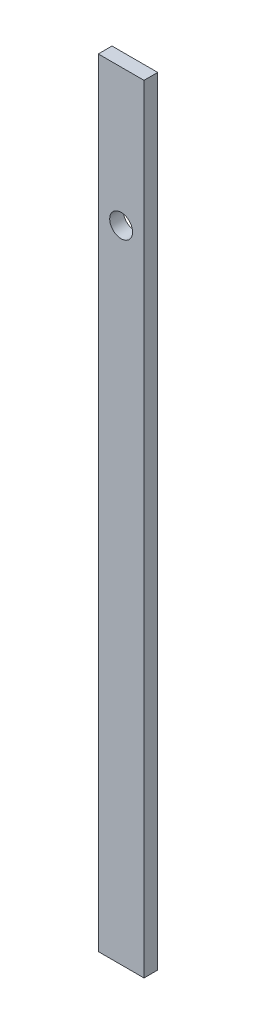
ISO-10303-21;
HEADER;
FILE_DESCRIPTION(('STEP AP214'),'2;1');
FILE_NAME('part.step','',(''),(''),'','','');
FILE_SCHEMA(('AUTOMOTIVE_DESIGN { 1 0 10303 214 1 1 1 1 }'));
ENDSEC;
DATA;
#1=APPLICATION_CONTEXT('core data for automotive mechanical design processes');
#2=APPLICATION_PROTOCOL_DEFINITION('international standard','automotive_design',2000,#1);
#3=PRODUCT_CONTEXT('',#1,'mechanical');
#4=PRODUCT('Part','Part','',(#3));
#5=PRODUCT_RELATED_PRODUCT_CATEGORY('part','',(#4));
#6=PRODUCT_DEFINITION_FORMATION('','',#4);
#7=PRODUCT_DEFINITION_CONTEXT('part definition',#1,'design');
#8=PRODUCT_DEFINITION('design','',#6,#7);
#9=PRODUCT_DEFINITION_SHAPE('','',#8);
#10=(LENGTH_UNIT() NAMED_UNIT(*) SI_UNIT(.MILLI.,.METRE.));
#11=(NAMED_UNIT(*) PLANE_ANGLE_UNIT() SI_UNIT($,.RADIAN.));
#12=(NAMED_UNIT(*) SI_UNIT($,.STERADIAN.) SOLID_ANGLE_UNIT());
#13=UNCERTAINTY_MEASURE_WITH_UNIT(LENGTH_MEASURE(1.E-05),#10,'distance_accuracy_value','');
#14=(GEOMETRIC_REPRESENTATION_CONTEXT(3) GLOBAL_UNCERTAINTY_ASSIGNED_CONTEXT((#13)) GLOBAL_UNIT_ASSIGNED_CONTEXT((#10,
#11,#12)) REPRESENTATION_CONTEXT('',''));
#15=CARTESIAN_POINT('',(0.,0.,0.));
#16=DIRECTION('',(0.,0.,1.));
#17=DIRECTION('',(1.,0.,0.));
#18=AXIS2_PLACEMENT_3D('',#15,#16,#17);
#19=CARTESIAN_POINT('',(0.,0.,3.));
#20=DIRECTION('',(0.,0.,-1.));
#21=DIRECTION('',(-1.,0.,0.));
#22=AXIS2_PLACEMENT_3D('',#19,#20,#21);
#23=PLANE('',#22);
#24=DIRECTION('',(0.,1.,0.));
#25=VECTOR('',#24,1.);
#26=CARTESIAN_POINT('',(5.,-85.,3.));
#27=LINE('',#26,#25);
#28=CARTESIAN_POINT('',(5.,-85.,3.));
#29=VERTEX_POINT('',#28);
#30=CARTESIAN_POINT('',(5.,85.,3.));
#31=VERTEX_POINT('',#30);
#32=EDGE_CURVE('E85',#29,#31,#27,.T.);
#33=ORIENTED_EDGE('',*,*,#32,.T.);
#34=DIRECTION('',(-1.,0.,0.));
#35=VECTOR('',#34,1.);
#36=CARTESIAN_POINT('',(-5.,85.,3.));
#37=LINE('',#36,#35);
#38=CARTESIAN_POINT('',(-5.,85.,3.));
#39=VERTEX_POINT('',#38);
#40=EDGE_CURVE('E80',#31,#39,#37,.T.);
#41=ORIENTED_EDGE('',*,*,#40,.T.);
#42=DIRECTION('',(0.,-1.,0.));
#43=VECTOR('',#42,1.);
#44=CARTESIAN_POINT('',(-5.,-85.,3.));
#45=LINE('',#44,#43);
#46=CARTESIAN_POINT('',(-5.,-85.,3.));
#47=VERTEX_POINT('',#46);
#48=EDGE_CURVE('E83',#39,#47,#45,.T.);
#49=ORIENTED_EDGE('',*,*,#48,.T.);
#50=DIRECTION('',(1.,0.,0.));
#51=VECTOR('',#50,1.);
#52=CARTESIAN_POINT('',(-5.,-85.,3.));
#53=LINE('',#52,#51);
#54=EDGE_CURVE('E50',#47,#29,#53,.T.);
#55=ORIENTED_EDGE('',*,*,#54,.T.);
#56=EDGE_LOOP('',(#33,#41,#49,#55));
#57=FACE_BOUND('',#56,.T.);
#58=CARTESIAN_POINT('',(0.,55.,3.));
#59=DIRECTION('',(0.,0.,1.));
#60=DIRECTION('',(1.,0.,0.));
#61=AXIS2_PLACEMENT_3D('',#58,#59,#60);
#62=CIRCLE('',#61,2.5);
#63=CARTESIAN_POINT('',(2.5,55.,3.));
#64=VERTEX_POINT('',#63);
#65=EDGE_CURVE('E100',#64,#64,#62,.T.);
#66=ORIENTED_EDGE('',*,*,#65,.F.);
#67=EDGE_LOOP('',(#66));
#68=FACE_BOUND('',#67,.T.);
#69=ADVANCED_FACE('F33',(#57,#68),#23,.F.);
#70=CARTESIAN_POINT('',(0.,0.,0.));
#71=DIRECTION('',(0.,0.,-1.));
#72=DIRECTION('',(-1.,0.,0.));
#73=AXIS2_PLACEMENT_3D('',#70,#71,#72);
#74=PLANE('',#73);
#75=DIRECTION('',(0.,1.,0.));
#76=VECTOR('',#75,1.);
#77=CARTESIAN_POINT('',(5.,-85.,0.));
#78=LINE('',#77,#76);
#79=CARTESIAN_POINT('',(5.,-85.,0.));
#80=VERTEX_POINT('',#79);
#81=CARTESIAN_POINT('',(5.,85.,0.));
#82=VERTEX_POINT('',#81);
#83=EDGE_CURVE('E97',#80,#82,#78,.T.);
#84=ORIENTED_EDGE('',*,*,#83,.F.);
#85=DIRECTION('',(1.,0.,0.));
#86=VECTOR('',#85,1.);
#87=CARTESIAN_POINT('',(-5.,-85.,0.));
#88=LINE('',#87,#86);
#89=CARTESIAN_POINT('',(-5.,-85.,0.));
#90=VERTEX_POINT('',#89);
#91=EDGE_CURVE('E73',#90,#80,#88,.T.);
#92=ORIENTED_EDGE('',*,*,#91,.F.);
#93=DIRECTION('',(0.,-1.,0.));
#94=VECTOR('',#93,1.);
#95=CARTESIAN_POINT('',(-5.,-85.,0.));
#96=LINE('',#95,#94);
#97=CARTESIAN_POINT('',(-5.,85.,0.));
#98=VERTEX_POINT('',#97);
#99=EDGE_CURVE('E67',#98,#90,#96,.T.);
#100=ORIENTED_EDGE('',*,*,#99,.F.);
#101=DIRECTION('',(-1.,0.,0.));
#102=VECTOR('',#101,1.);
#103=CARTESIAN_POINT('',(-5.,85.,0.));
#104=LINE('',#103,#102);
#105=EDGE_CURVE('E89',#82,#98,#104,.T.);
#106=ORIENTED_EDGE('',*,*,#105,.F.);
#107=EDGE_LOOP('',(#84,#92,#100,#106));
#108=FACE_BOUND('',#107,.T.);
#109=CARTESIAN_POINT('',(0.,55.,0.));
#110=DIRECTION('',(0.,0.,1.));
#111=DIRECTION('',(1.,0.,0.));
#112=AXIS2_PLACEMENT_3D('',#109,#110,#111);
#113=CIRCLE('',#112,2.5);
#114=CARTESIAN_POINT('',(2.5,55.,0.));
#115=VERTEX_POINT('',#114);
#116=EDGE_CURVE('E112',#115,#115,#113,.T.);
#117=ORIENTED_EDGE('',*,*,#116,.T.);
#118=EDGE_LOOP('',(#117));
#119=FACE_BOUND('',#118,.T.);
#120=ADVANCED_FACE('F108',(#108,#119),#74,.T.);
#121=CARTESIAN_POINT('',(5.,-85.,3.));
#122=DIRECTION('',(-1.,0.,0.));
#123=DIRECTION('',(0.,0.,1.));
#124=AXIS2_PLACEMENT_3D('',#121,#122,#123);
#125=PLANE('',#124);
#126=ORIENTED_EDGE('',*,*,#83,.T.);
#127=DIRECTION('',(0.,0.,-1.));
#128=VECTOR('',#127,1.);
#129=CARTESIAN_POINT('',(5.,85.,3.));
#130=LINE('',#129,#128);
#131=EDGE_CURVE('E11',#31,#82,#130,.T.);
#132=ORIENTED_EDGE('',*,*,#131,.F.);
#133=ORIENTED_EDGE('',*,*,#32,.F.);
#134=DIRECTION('',(0.,0.,-1.));
#135=VECTOR('',#134,1.);
#136=CARTESIAN_POINT('',(5.,-85.,3.));
#137=LINE('',#136,#135);
#138=EDGE_CURVE('E93',#29,#80,#137,.T.);
#139=ORIENTED_EDGE('',*,*,#138,.T.);
#140=EDGE_LOOP('',(#126,#132,#133,#139));
#141=FACE_BOUND('',#140,.T.);
#142=ADVANCED_FACE('F35',(#141),#125,.F.);
#143=CARTESIAN_POINT('',(-5.,85.,3.));
#144=DIRECTION('',(0.,-1.,0.));
#145=DIRECTION('',(0.,0.,-1.));
#146=AXIS2_PLACEMENT_3D('',#143,#144,#145);
#147=PLANE('',#146);
#148=ORIENTED_EDGE('',*,*,#105,.T.);
#149=DIRECTION('',(0.,0.,-1.));
#150=VECTOR('',#149,1.);
#151=CARTESIAN_POINT('',(-5.,85.,3.));
#152=LINE('',#151,#150);
#153=EDGE_CURVE('E42',#39,#98,#152,.T.);
#154=ORIENTED_EDGE('',*,*,#153,.F.);
#155=ORIENTED_EDGE('',*,*,#40,.F.);
#156=ORIENTED_EDGE('',*,*,#131,.T.);
#157=EDGE_LOOP('',(#148,#154,#155,#156));
#158=FACE_BOUND('',#157,.T.);
#159=ADVANCED_FACE('F88',(#158),#147,.F.);
#160=CARTESIAN_POINT('',(-5.,-85.,3.));
#161=DIRECTION('',(1.,0.,0.));
#162=DIRECTION('',(0.,0.,-1.));
#163=AXIS2_PLACEMENT_3D('',#160,#161,#162);
#164=PLANE('',#163);
#165=ORIENTED_EDGE('',*,*,#99,.T.);
#166=DIRECTION('',(0.,0.,-1.));
#167=VECTOR('',#166,1.);
#168=CARTESIAN_POINT('',(-5.,-85.,3.));
#169=LINE('',#168,#167);
#170=EDGE_CURVE('E90',#47,#90,#169,.T.);
#171=ORIENTED_EDGE('',*,*,#170,.F.);
#172=ORIENTED_EDGE('',*,*,#48,.F.);
#173=ORIENTED_EDGE('',*,*,#153,.T.);
#174=EDGE_LOOP('',(#165,#171,#172,#173));
#175=FACE_BOUND('',#174,.T.);
#176=ADVANCED_FACE('F91',(#175),#164,.F.);
#177=CARTESIAN_POINT('',(-5.,-85.,3.));
#178=DIRECTION('',(0.,1.,0.));
#179=DIRECTION('',(0.,0.,1.));
#180=AXIS2_PLACEMENT_3D('',#177,#178,#179);
#181=PLANE('',#180);
#182=ORIENTED_EDGE('',*,*,#91,.T.);
#183=ORIENTED_EDGE('',*,*,#138,.F.);
#184=ORIENTED_EDGE('',*,*,#54,.F.);
#185=ORIENTED_EDGE('',*,*,#170,.T.);
#186=EDGE_LOOP('',(#182,#183,#184,#185));
#187=FACE_BOUND('',#186,.T.);
#188=ADVANCED_FACE('F105',(#187),#181,.F.);
#189=CARTESIAN_POINT('',(0.,55.,3.));
#190=DIRECTION('',(0.,0.,-1.));
#191=DIRECTION('',(-1.,0.,0.));
#192=AXIS2_PLACEMENT_3D('',#189,#190,#191);
#193=CYLINDRICAL_SURFACE('',#192,2.5);
#194=ORIENTED_EDGE('',*,*,#65,.T.);
#195=EDGE_LOOP('',(#194));
#196=FACE_BOUND('',#195,.T.);
#197=ORIENTED_EDGE('',*,*,#116,.F.);
#198=EDGE_LOOP('',(#197));
#199=FACE_BOUND('',#198,.T.);
#200=ADVANCED_FACE('F118',(#196,#199),#193,.F.);
#201=CLOSED_SHELL('',(#69,#120,#142,#159,#176,#188,#200));
#202=MANIFOLD_SOLID_BREP('B2',#201);
#203=ADVANCED_BREP_SHAPE_REPRESENTATION('',(#18,#202),#14);
#204=SHAPE_DEFINITION_REPRESENTATION(#9,#203);
ENDSEC;
END-ISO-10303-21;
